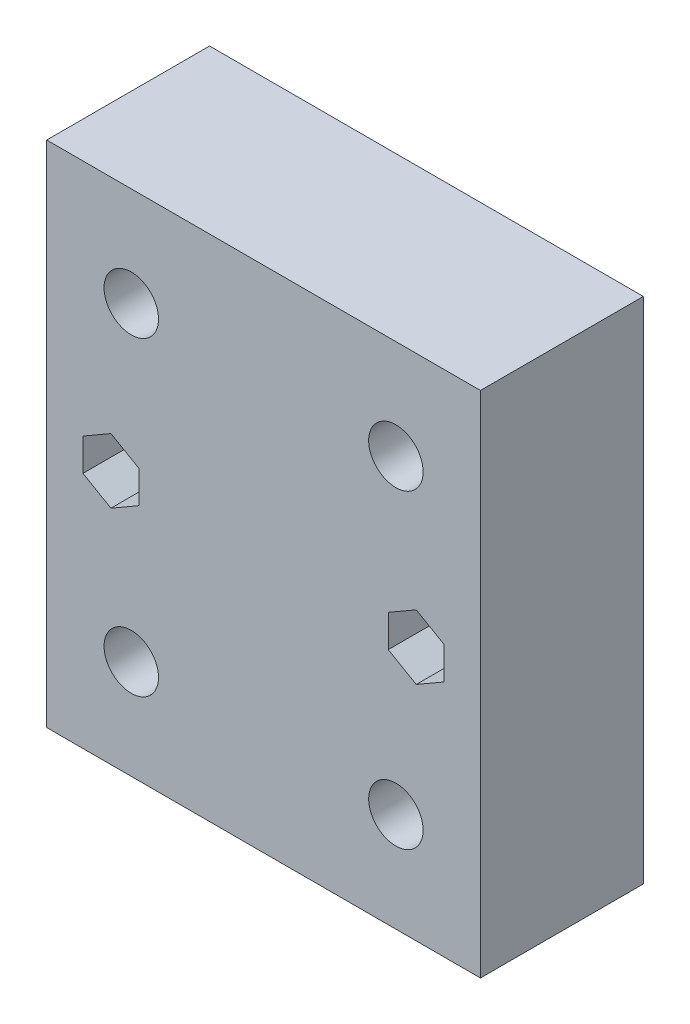
ISO-10303-21;
HEADER;
FILE_DESCRIPTION(('STEP AP214'),'2;1');
FILE_NAME('part.step','',(''),(''),'','','');
FILE_SCHEMA(('AUTOMOTIVE_DESIGN { 1 0 10303 214 1 1 1 1 }'));
ENDSEC;
DATA;
#1=APPLICATION_CONTEXT('core data for automotive mechanical design processes');
#2=APPLICATION_PROTOCOL_DEFINITION('international standard','automotive_design',2000,#1);
#3=PRODUCT_CONTEXT('',#1,'mechanical');
#4=PRODUCT('Part','Part','',(#3));
#5=PRODUCT_RELATED_PRODUCT_CATEGORY('part','',(#4));
#6=PRODUCT_DEFINITION_FORMATION('','',#4);
#7=PRODUCT_DEFINITION_CONTEXT('part definition',#1,'design');
#8=PRODUCT_DEFINITION('design','',#6,#7);
#9=PRODUCT_DEFINITION_SHAPE('','',#8);
#10=(LENGTH_UNIT() NAMED_UNIT(*) SI_UNIT(.MILLI.,.METRE.));
#11=(NAMED_UNIT(*) PLANE_ANGLE_UNIT() SI_UNIT($,.RADIAN.));
#12=(NAMED_UNIT(*) SI_UNIT($,.STERADIAN.) SOLID_ANGLE_UNIT());
#13=UNCERTAINTY_MEASURE_WITH_UNIT(LENGTH_MEASURE(1.E-05),#10,'distance_accuracy_value','');
#14=(GEOMETRIC_REPRESENTATION_CONTEXT(3) GLOBAL_UNCERTAINTY_ASSIGNED_CONTEXT((#13)) GLOBAL_UNIT_ASSIGNED_CONTEXT((#10,
#11,#12)) REPRESENTATION_CONTEXT('',''));
#15=CARTESIAN_POINT('',(0.,0.,0.));
#16=DIRECTION('',(0.,0.,1.));
#17=DIRECTION('',(1.,0.,0.));
#18=AXIS2_PLACEMENT_3D('',#15,#16,#17);
#19=CARTESIAN_POINT('',(-15.,0.,10.));
#20=DIRECTION('',(0.,0.,-1.));
#21=DIRECTION('',(-1.,0.,0.));
#22=AXIS2_PLACEMENT_3D('',#19,#20,#21);
#23=CYLINDRICAL_SURFACE('',#22,1.75);
#24=CARTESIAN_POINT('',(-15.,0.,0.));
#25=DIRECTION('',(0.,0.,-1.));
#26=DIRECTION('',(1.,0.,0.));
#27=AXIS2_PLACEMENT_3D('',#24,#25,#26);
#28=CIRCLE('',#27,1.75);
#29=CARTESIAN_POINT('',(-13.25,0.,0.));
#30=VERTEX_POINT('',#29);
#31=EDGE_CURVE('E362',#30,#30,#28,.T.);
#32=ORIENTED_EDGE('',*,*,#31,.T.);
#33=EDGE_LOOP('',(#32));
#34=FACE_BOUND('',#33,.T.);
#35=CARTESIAN_POINT('',(-15.,0.,5.));
#36=DIRECTION('',(0.,0.,1.));
#37=DIRECTION('',(1.,0.,0.));
#38=AXIS2_PLACEMENT_3D('',#35,#36,#37);
#39=CIRCLE('',#38,1.75);
#40=CARTESIAN_POINT('',(-13.25,0.,5.));
#41=VERTEX_POINT('',#40);
#42=EDGE_CURVE('E47',#41,#41,#39,.F.);
#43=ORIENTED_EDGE('',*,*,#42,.F.);
#44=EDGE_LOOP('',(#43));
#45=FACE_BOUND('',#44,.T.);
#46=ADVANCED_FACE('F43',(#34,#45),#23,.F.);
#47=CARTESIAN_POINT('',(0.,0.,16.));
#48=DIRECTION('',(0.,0.,-1.));
#49=DIRECTION('',(-1.,0.,0.));
#50=AXIS2_PLACEMENT_3D('',#47,#48,#49);
#51=PLANE('',#50);
#52=DIRECTION('',(0.,1.,0.));
#53=VECTOR('',#52,1.);
#54=CARTESIAN_POINT('',(12.25,-1.58771324027148,16.));
#55=LINE('',#54,#53);
#56=CARTESIAN_POINT('',(12.25,-1.58771324027148,16.));
#57=VERTEX_POINT('',#56);
#58=CARTESIAN_POINT('',(12.25,1.58771324027147,16.));
#59=VERTEX_POINT('',#58);
#60=EDGE_CURVE('E202',#57,#59,#55,.T.);
#61=ORIENTED_EDGE('',*,*,#60,.T.);
#62=DIRECTION('',(0.866025403784439,0.5,0.));
#63=VECTOR('',#62,1.);
#64=CARTESIAN_POINT('',(12.25,1.58771324027147,16.));
#65=LINE('',#64,#63);
#66=CARTESIAN_POINT('',(15.,3.17542648054294,16.));
#67=VERTEX_POINT('',#66);
#68=EDGE_CURVE('E193',#59,#67,#65,.T.);
#69=ORIENTED_EDGE('',*,*,#68,.T.);
#70=DIRECTION('',(0.866025403784439,-0.5,0.));
#71=VECTOR('',#70,1.);
#72=CARTESIAN_POINT('',(15.,3.17542648054294,16.));
#73=LINE('',#72,#71);
#74=CARTESIAN_POINT('',(17.75,1.58771324027147,16.));
#75=VERTEX_POINT('',#74);
#76=EDGE_CURVE('E205',#67,#75,#73,.T.);
#77=ORIENTED_EDGE('',*,*,#76,.T.);
#78=DIRECTION('',(0.,-1.,0.));
#79=VECTOR('',#78,1.);
#80=CARTESIAN_POINT('',(17.75,1.58771324027147,16.));
#81=LINE('',#80,#79);
#82=CARTESIAN_POINT('',(17.75,-1.58771324027147,16.));
#83=VERTEX_POINT('',#82);
#84=EDGE_CURVE('E61',#75,#83,#81,.T.);
#85=ORIENTED_EDGE('',*,*,#84,.T.);
#86=DIRECTION('',(-0.866025403784439,-0.5,0.));
#87=VECTOR('',#86,1.);
#88=CARTESIAN_POINT('',(17.75,-1.58771324027147,16.));
#89=LINE('',#88,#87);
#90=CARTESIAN_POINT('',(15.,-3.17542648054295,16.));
#91=VERTEX_POINT('',#90);
#92=EDGE_CURVE('E224',#83,#91,#89,.T.);
#93=ORIENTED_EDGE('',*,*,#92,.T.);
#94=DIRECTION('',(-0.866025403784439,0.5,0.));
#95=VECTOR('',#94,1.);
#96=CARTESIAN_POINT('',(15.,-3.17542648054295,16.));
#97=LINE('',#96,#95);
#98=EDGE_CURVE('E228',#91,#57,#97,.T.);
#99=ORIENTED_EDGE('',*,*,#98,.T.);
#100=EDGE_LOOP('',(#61,#69,#77,#85,#93,#99));
#101=FACE_BOUND('',#100,.T.);
#102=DIRECTION('',(0.866025403784439,-0.5,0.));
#103=VECTOR('',#102,1.);
#104=CARTESIAN_POINT('',(-12.25,1.58771324027147,16.));
#105=LINE('',#104,#103);
#106=CARTESIAN_POINT('',(-15.,3.17542648054294,16.));
#107=VERTEX_POINT('',#106);
#108=CARTESIAN_POINT('',(-12.25,1.58771324027147,16.));
#109=VERTEX_POINT('',#108);
#110=EDGE_CURVE('E268',#107,#109,#105,.T.);
#111=ORIENTED_EDGE('',*,*,#110,.T.);
#112=DIRECTION('',(0.,-1.,0.));
#113=VECTOR('',#112,1.);
#114=CARTESIAN_POINT('',(-12.25,-1.58771324027148,16.));
#115=LINE('',#114,#113);
#116=CARTESIAN_POINT('',(-12.25,-1.58771324027148,16.));
#117=VERTEX_POINT('',#116);
#118=EDGE_CURVE('E289',#109,#117,#115,.T.);
#119=ORIENTED_EDGE('',*,*,#118,.T.);
#120=DIRECTION('',(-0.866025403784439,-0.5,0.));
#121=VECTOR('',#120,1.);
#122=CARTESIAN_POINT('',(-15.,-3.17542648054295,16.));
#123=LINE('',#122,#121);
#124=CARTESIAN_POINT('',(-15.,-3.17542648054294,16.));
#125=VERTEX_POINT('',#124);
#126=EDGE_CURVE('E321',#117,#125,#123,.T.);
#127=ORIENTED_EDGE('',*,*,#126,.T.);
#128=DIRECTION('',(-0.866025403784439,0.5,0.));
#129=VECTOR('',#128,1.);
#130=CARTESIAN_POINT('',(-17.75,-1.58771324027147,16.));
#131=LINE('',#130,#129);
#132=CARTESIAN_POINT('',(-17.75,-1.58771324027147,16.));
#133=VERTEX_POINT('',#132);
#134=EDGE_CURVE('E69',#125,#133,#131,.T.);
#135=ORIENTED_EDGE('',*,*,#134,.T.);
#136=DIRECTION('',(0.,1.,0.));
#137=VECTOR('',#136,1.);
#138=CARTESIAN_POINT('',(-17.75,1.58771324027147,16.));
#139=LINE('',#138,#137);
#140=CARTESIAN_POINT('',(-17.75,1.58771324027147,16.));
#141=VERTEX_POINT('',#140);
#142=EDGE_CURVE('E315',#133,#141,#139,.T.);
#143=ORIENTED_EDGE('',*,*,#142,.T.);
#144=DIRECTION('',(0.866025403784439,0.5,0.));
#145=VECTOR('',#144,1.);
#146=CARTESIAN_POINT('',(-15.,3.17542648054294,16.));
#147=LINE('',#146,#145);
#148=EDGE_CURVE('E311',#141,#107,#147,.T.);
#149=ORIENTED_EDGE('',*,*,#148,.T.);
#150=EDGE_LOOP('',(#111,#119,#127,#135,#143,#149));
#151=FACE_BOUND('',#150,.T.);
#152=DIRECTION('',(0.,-1.,0.));
#153=VECTOR('',#152,1.);
#154=CARTESIAN_POINT('',(-21.3114754098361,25.,16.));
#155=LINE('',#154,#153);
#156=CARTESIAN_POINT('',(-21.3114754098361,25.,16.));
#157=VERTEX_POINT('',#156);
#158=CARTESIAN_POINT('',(-21.3114754098361,-25.,16.));
#159=VERTEX_POINT('',#158);
#160=EDGE_CURVE('E424',#157,#159,#155,.T.);
#161=ORIENTED_EDGE('',*,*,#160,.T.);
#162=DIRECTION('',(1.,0.,0.));
#163=VECTOR('',#162,1.);
#164=CARTESIAN_POINT('',(21.3114754098361,-25.,16.));
#165=LINE('',#164,#163);
#166=CARTESIAN_POINT('',(21.3114754098361,-25.,16.));
#167=VERTEX_POINT('',#166);
#168=EDGE_CURVE('E428',#159,#167,#165,.T.);
#169=ORIENTED_EDGE('',*,*,#168,.T.);
#170=DIRECTION('',(0.,1.,0.));
#171=VECTOR('',#170,1.);
#172=CARTESIAN_POINT('',(21.3114754098361,25.,16.));
#173=LINE('',#172,#171);
#174=CARTESIAN_POINT('',(21.3114754098361,25.,16.));
#175=VERTEX_POINT('',#174);
#176=EDGE_CURVE('E432',#167,#175,#173,.T.);
#177=ORIENTED_EDGE('',*,*,#176,.T.);
#178=DIRECTION('',(-1.,0.,0.));
#179=VECTOR('',#178,1.);
#180=CARTESIAN_POINT('',(21.3114754098361,25.,16.));
#181=LINE('',#180,#179);
#182=EDGE_CURVE('E435',#175,#157,#181,.T.);
#183=ORIENTED_EDGE('',*,*,#182,.T.);
#184=EDGE_LOOP('',(#161,#169,#177,#183));
#185=FACE_BOUND('',#184,.T.);
#186=CARTESIAN_POINT('',(-13.,-15.25,16.));
#187=DIRECTION('',(0.,0.,1.));
#188=DIRECTION('',(1.,0.,0.));
#189=AXIS2_PLACEMENT_3D('',#186,#187,#188);
#190=CIRCLE('',#189,2.67701813439658);
#191=CARTESIAN_POINT('',(-10.3229818656034,-15.25,16.));
#192=VERTEX_POINT('',#191);
#193=EDGE_CURVE('E416',#192,#192,#190,.T.);
#194=ORIENTED_EDGE('',*,*,#193,.F.);
#195=EDGE_LOOP('',(#194));
#196=FACE_BOUND('',#195,.T.);
#197=CARTESIAN_POINT('',(13.,-15.25,16.));
#198=DIRECTION('',(0.,0.,1.));
#199=DIRECTION('',(-1.,0.,0.));
#200=AXIS2_PLACEMENT_3D('',#197,#198,#199);
#201=CIRCLE('',#200,2.67701813439658);
#202=CARTESIAN_POINT('',(10.3229818656034,-15.25,16.));
#203=VERTEX_POINT('',#202);
#204=EDGE_CURVE('E408',#203,#203,#201,.T.);
#205=ORIENTED_EDGE('',*,*,#204,.F.);
#206=EDGE_LOOP('',(#205));
#207=FACE_BOUND('',#206,.T.);
#208=CARTESIAN_POINT('',(13.,15.25,16.));
#209=DIRECTION('',(0.,0.,1.));
#210=DIRECTION('',(1.,0.,0.));
#211=AXIS2_PLACEMENT_3D('',#208,#209,#210);
#212=CIRCLE('',#211,2.67701813439658);
#213=CARTESIAN_POINT('',(15.6770181343966,15.25,16.));
#214=VERTEX_POINT('',#213);
#215=EDGE_CURVE('E400',#214,#214,#212,.T.);
#216=ORIENTED_EDGE('',*,*,#215,.F.);
#217=EDGE_LOOP('',(#216));
#218=FACE_BOUND('',#217,.T.);
#219=CARTESIAN_POINT('',(-13.,15.25,16.));
#220=DIRECTION('',(0.,0.,1.));
#221=DIRECTION('',(-1.,0.,0.));
#222=AXIS2_PLACEMENT_3D('',#219,#220,#221);
#223=CIRCLE('',#222,2.67701813439658);
#224=CARTESIAN_POINT('',(-15.6770181343966,15.25,16.));
#225=VERTEX_POINT('',#224);
#226=EDGE_CURVE('E392',#225,#225,#223,.T.);
#227=ORIENTED_EDGE('',*,*,#226,.F.);
#228=EDGE_LOOP('',(#227));
#229=FACE_BOUND('',#228,.T.);
#230=ADVANCED_FACE('F210',(#101,#151,#185,#196,#207,#218,#229),#51,.F.);
#231=CARTESIAN_POINT('',(0.,0.,0.));
#232=DIRECTION('',(0.,0.,-1.));
#233=DIRECTION('',(-1.,0.,0.));
#234=AXIS2_PLACEMENT_3D('',#231,#232,#233);
#235=PLANE('',#234);
#236=CARTESIAN_POINT('',(15.,0.,0.));
#237=DIRECTION('',(0.,0.,-1.));
#238=DIRECTION('',(-1.,0.,0.));
#239=AXIS2_PLACEMENT_3D('',#236,#237,#238);
#240=CIRCLE('',#239,1.75);
#241=CARTESIAN_POINT('',(13.25,0.,0.));
#242=VERTEX_POINT('',#241);
#243=EDGE_CURVE('E375',#242,#242,#240,.T.);
#244=ORIENTED_EDGE('',*,*,#243,.F.);
#245=EDGE_LOOP('',(#244));
#246=FACE_BOUND('',#245,.T.);
#247=ORIENTED_EDGE('',*,*,#31,.F.);
#248=EDGE_LOOP('',(#247));
#249=FACE_BOUND('',#248,.T.);
#250=CARTESIAN_POINT('',(0.,0.,0.));
#251=DIRECTION('',(0.,0.,1.));
#252=DIRECTION('',(1.,0.,0.));
#253=AXIS2_PLACEMENT_3D('',#250,#251,#252);
#254=CIRCLE('',#253,11.);
#255=CARTESIAN_POINT('',(11.,0.,0.));
#256=VERTEX_POINT('',#255);
#257=EDGE_CURVE('E379',#256,#256,#254,.T.);
#258=ORIENTED_EDGE('',*,*,#257,.T.);
#259=EDGE_LOOP('',(#258));
#260=FACE_BOUND('',#259,.T.);
#261=CARTESIAN_POINT('',(13.,15.25,0.));
#262=DIRECTION('',(0.,0.,1.));
#263=DIRECTION('',(1.,0.,0.));
#264=AXIS2_PLACEMENT_3D('',#261,#262,#263);
#265=CIRCLE('',#264,2.67701813439658);
#266=CARTESIAN_POINT('',(15.6770181343966,15.25,0.));
#267=VERTEX_POINT('',#266);
#268=EDGE_CURVE('E396',#267,#267,#265,.T.);
#269=ORIENTED_EDGE('',*,*,#268,.T.);
#270=EDGE_LOOP('',(#269));
#271=FACE_BOUND('',#270,.T.);
#272=CARTESIAN_POINT('',(-13.,-15.25,0.));
#273=DIRECTION('',(0.,0.,1.));
#274=DIRECTION('',(1.,0.,0.));
#275=AXIS2_PLACEMENT_3D('',#272,#273,#274);
#276=CIRCLE('',#275,2.67701813439658);
#277=CARTESIAN_POINT('',(-10.3229818656034,-15.25,0.));
#278=VERTEX_POINT('',#277);
#279=EDGE_CURVE('E412',#278,#278,#276,.T.);
#280=ORIENTED_EDGE('',*,*,#279,.T.);
#281=EDGE_LOOP('',(#280));
#282=FACE_BOUND('',#281,.T.);
#283=DIRECTION('',(0.,-1.,0.));
#284=VECTOR('',#283,1.);
#285=CARTESIAN_POINT('',(-21.3114754098361,25.,0.));
#286=LINE('',#285,#284);
#287=CARTESIAN_POINT('',(-21.3114754098361,25.,0.));
#288=VERTEX_POINT('',#287);
#289=CARTESIAN_POINT('',(-21.3114754098361,-25.,0.));
#290=VERTEX_POINT('',#289);
#291=EDGE_CURVE('E420',#288,#290,#286,.T.);
#292=ORIENTED_EDGE('',*,*,#291,.F.);
#293=DIRECTION('',(-1.,0.,0.));
#294=VECTOR('',#293,1.);
#295=CARTESIAN_POINT('',(21.3114754098361,25.,0.));
#296=LINE('',#295,#294);
#297=CARTESIAN_POINT('',(21.3114754098361,25.,0.));
#298=VERTEX_POINT('',#297);
#299=EDGE_CURVE('E429',#298,#288,#296,.T.);
#300=ORIENTED_EDGE('',*,*,#299,.F.);
#301=DIRECTION('',(0.,1.,0.));
#302=VECTOR('',#301,1.);
#303=CARTESIAN_POINT('',(21.3114754098361,25.,0.));
#304=LINE('',#303,#302);
#305=CARTESIAN_POINT('',(21.3114754098361,-25.,0.));
#306=VERTEX_POINT('',#305);
#307=EDGE_CURVE('E445',#306,#298,#304,.T.);
#308=ORIENTED_EDGE('',*,*,#307,.F.);
#309=DIRECTION('',(1.,0.,0.));
#310=VECTOR('',#309,1.);
#311=CARTESIAN_POINT('',(21.3114754098361,-25.,0.));
#312=LINE('',#311,#310);
#313=EDGE_CURVE('E442',#290,#306,#312,.T.);
#314=ORIENTED_EDGE('',*,*,#313,.F.);
#315=EDGE_LOOP('',(#292,#300,#308,#314));
#316=FACE_BOUND('',#315,.T.);
#317=CARTESIAN_POINT('',(13.,-15.25,0.));
#318=DIRECTION('',(0.,0.,1.));
#319=DIRECTION('',(-1.,0.,0.));
#320=AXIS2_PLACEMENT_3D('',#317,#318,#319);
#321=CIRCLE('',#320,2.67701813439658);
#322=CARTESIAN_POINT('',(10.3229818656034,-15.25,0.));
#323=VERTEX_POINT('',#322);
#324=EDGE_CURVE('E404',#323,#323,#321,.T.);
#325=ORIENTED_EDGE('',*,*,#324,.T.);
#326=EDGE_LOOP('',(#325));
#327=FACE_BOUND('',#326,.T.);
#328=CARTESIAN_POINT('',(-13.,15.25,0.));
#329=DIRECTION('',(0.,0.,1.));
#330=DIRECTION('',(-1.,0.,0.));
#331=AXIS2_PLACEMENT_3D('',#328,#329,#330);
#332=CIRCLE('',#331,2.67701813439658);
#333=CARTESIAN_POINT('',(-15.6770181343966,15.25,0.));
#334=VERTEX_POINT('',#333);
#335=EDGE_CURVE('E387',#334,#334,#332,.T.);
#336=ORIENTED_EDGE('',*,*,#335,.T.);
#337=EDGE_LOOP('',(#336));
#338=FACE_BOUND('',#337,.T.);
#339=ADVANCED_FACE('F476',(#246,#249,#260,#271,#282,#316,#327,#338),#235,.T.);
#340=CARTESIAN_POINT('',(-21.3114754098361,25.,16.));
#341=DIRECTION('',(1.,0.,0.));
#342=DIRECTION('',(0.,0.,-1.));
#343=AXIS2_PLACEMENT_3D('',#340,#341,#342);
#344=PLANE('',#343);
#345=ORIENTED_EDGE('',*,*,#291,.T.);
#346=DIRECTION('',(0.,0.,-1.));
#347=VECTOR('',#346,1.);
#348=CARTESIAN_POINT('',(-21.3114754098361,-25.,16.));
#349=LINE('',#348,#347);
#350=EDGE_CURVE('E11',#159,#290,#349,.T.);
#351=ORIENTED_EDGE('',*,*,#350,.F.);
#352=ORIENTED_EDGE('',*,*,#160,.F.);
#353=DIRECTION('',(0.,0.,-1.));
#354=VECTOR('',#353,1.);
#355=CARTESIAN_POINT('',(-21.3114754098361,25.,16.));
#356=LINE('',#355,#354);
#357=EDGE_CURVE('E438',#157,#288,#356,.T.);
#358=ORIENTED_EDGE('',*,*,#357,.T.);
#359=EDGE_LOOP('',(#345,#351,#352,#358));
#360=FACE_BOUND('',#359,.T.);
#361=ADVANCED_FACE('F45',(#360),#344,.F.);
#362=CARTESIAN_POINT('',(21.3114754098361,-25.,16.));
#363=DIRECTION('',(0.,1.,0.));
#364=DIRECTION('',(0.,0.,1.));
#365=AXIS2_PLACEMENT_3D('',#362,#363,#364);
#366=PLANE('',#365);
#367=DIRECTION('',(1.,0.,0.));
#368=VECTOR('',#367,1.);
#369=CARTESIAN_POINT('',(4.51701883571232,-25.,11.));
#370=LINE('',#369,#368);
#371=CARTESIAN_POINT('',(-4.51701883571232,-25.,11.));
#372=VERTEX_POINT('',#371);
#373=CARTESIAN_POINT('',(4.51701883571232,-25.,11.));
#374=VERTEX_POINT('',#373);
#375=EDGE_CURVE('E348',#372,#374,#370,.T.);
#376=ORIENTED_EDGE('',*,*,#375,.F.);
#377=DIRECTION('',(0.,0.,-1.));
#378=VECTOR('',#377,1.);
#379=CARTESIAN_POINT('',(-4.51701883571232,-25.,11.));
#380=LINE('',#379,#378);
#381=CARTESIAN_POINT('',(-4.51701883571232,-25.,13.3875314082809));
#382=VERTEX_POINT('',#381);
#383=EDGE_CURVE('E345',#382,#372,#380,.T.);
#384=ORIENTED_EDGE('',*,*,#383,.F.);
#385=DIRECTION('',(-1.,0.,0.));
#386=VECTOR('',#385,1.);
#387=CARTESIAN_POINT('',(4.51701883571232,-25.,13.3875314082809));
#388=LINE('',#387,#386);
#389=CARTESIAN_POINT('',(4.51701883571232,-25.,13.3875314082809));
#390=VERTEX_POINT('',#389);
#391=EDGE_CURVE('E333',#390,#382,#388,.T.);
#392=ORIENTED_EDGE('',*,*,#391,.F.);
#393=DIRECTION('',(0.,0.,1.));
#394=VECTOR('',#393,1.);
#395=CARTESIAN_POINT('',(4.51701883571232,-25.,11.));
#396=LINE('',#395,#394);
#397=EDGE_CURVE('E352',#374,#390,#396,.T.);
#398=ORIENTED_EDGE('',*,*,#397,.F.);
#399=EDGE_LOOP('',(#376,#384,#392,#398));
#400=FACE_BOUND('',#399,.T.);
#401=ORIENTED_EDGE('',*,*,#313,.T.);
#402=DIRECTION('',(0.,0.,-1.));
#403=VECTOR('',#402,1.);
#404=CARTESIAN_POINT('',(21.3114754098361,-25.,16.));
#405=LINE('',#404,#403);
#406=EDGE_CURVE('E53',#167,#306,#405,.T.);
#407=ORIENTED_EDGE('',*,*,#406,.F.);
#408=ORIENTED_EDGE('',*,*,#168,.F.);
#409=ORIENTED_EDGE('',*,*,#350,.T.);
#410=EDGE_LOOP('',(#401,#407,#408,#409));
#411=FACE_BOUND('',#410,.T.);
#412=ADVANCED_FACE('F515',(#400,#411),#366,.F.);
#413=CARTESIAN_POINT('',(21.3114754098361,25.,16.));
#414=DIRECTION('',(-1.,0.,0.));
#415=DIRECTION('',(0.,0.,1.));
#416=AXIS2_PLACEMENT_3D('',#413,#414,#415);
#417=PLANE('',#416);
#418=ORIENTED_EDGE('',*,*,#307,.T.);
#419=DIRECTION('',(0.,0.,-1.));
#420=VECTOR('',#419,1.);
#421=CARTESIAN_POINT('',(21.3114754098361,25.,16.));
#422=LINE('',#421,#420);
#423=EDGE_CURVE('E453',#175,#298,#422,.T.);
#424=ORIENTED_EDGE('',*,*,#423,.F.);
#425=ORIENTED_EDGE('',*,*,#176,.F.);
#426=ORIENTED_EDGE('',*,*,#406,.T.);
#427=EDGE_LOOP('',(#418,#424,#425,#426));
#428=FACE_BOUND('',#427,.T.);
#429=ADVANCED_FACE('F512',(#428),#417,.F.);
#430=CARTESIAN_POINT('',(21.3114754098361,25.,16.));
#431=DIRECTION('',(0.,-1.,0.));
#432=DIRECTION('',(0.,0.,-1.));
#433=AXIS2_PLACEMENT_3D('',#430,#431,#432);
#434=PLANE('',#433);
#435=ORIENTED_EDGE('',*,*,#299,.T.);
#436=ORIENTED_EDGE('',*,*,#357,.F.);
#437=ORIENTED_EDGE('',*,*,#182,.F.);
#438=ORIENTED_EDGE('',*,*,#423,.T.);
#439=EDGE_LOOP('',(#435,#436,#437,#438));
#440=FACE_BOUND('',#439,.T.);
#441=ADVANCED_FACE('F504',(#440),#434,.F.);
#442=CARTESIAN_POINT('',(-13.,-15.25,16.));
#443=DIRECTION('',(0.,0.,-1.));
#444=DIRECTION('',(-1.,0.,0.));
#445=AXIS2_PLACEMENT_3D('',#442,#443,#444);
#446=CYLINDRICAL_SURFACE('',#445,2.67701813439658);
#447=ORIENTED_EDGE('',*,*,#193,.T.);
#448=EDGE_LOOP('',(#447));
#449=FACE_BOUND('',#448,.T.);
#450=ORIENTED_EDGE('',*,*,#279,.F.);
#451=EDGE_LOOP('',(#450));
#452=FACE_BOUND('',#451,.T.);
#453=ADVANCED_FACE('F501',(#449,#452),#446,.F.);
#454=CARTESIAN_POINT('',(13.,-15.25,16.));
#455=DIRECTION('',(0.,0.,-1.));
#456=DIRECTION('',(-1.,0.,0.));
#457=AXIS2_PLACEMENT_3D('',#454,#455,#456);
#458=CYLINDRICAL_SURFACE('',#457,2.67701813439658);
#459=ORIENTED_EDGE('',*,*,#204,.T.);
#460=EDGE_LOOP('',(#459));
#461=FACE_BOUND('',#460,.T.);
#462=ORIENTED_EDGE('',*,*,#324,.F.);
#463=EDGE_LOOP('',(#462));
#464=FACE_BOUND('',#463,.T.);
#465=ADVANCED_FACE('F497',(#461,#464),#458,.F.);
#466=CARTESIAN_POINT('',(13.,15.25,16.));
#467=DIRECTION('',(0.,0.,-1.));
#468=DIRECTION('',(-1.,0.,0.));
#469=AXIS2_PLACEMENT_3D('',#466,#467,#468);
#470=CYLINDRICAL_SURFACE('',#469,2.67701813439658);
#471=ORIENTED_EDGE('',*,*,#215,.T.);
#472=EDGE_LOOP('',(#471));
#473=FACE_BOUND('',#472,.T.);
#474=ORIENTED_EDGE('',*,*,#268,.F.);
#475=EDGE_LOOP('',(#474));
#476=FACE_BOUND('',#475,.T.);
#477=ADVANCED_FACE('F493',(#473,#476),#470,.F.);
#478=CARTESIAN_POINT('',(-13.,15.25,16.));
#479=DIRECTION('',(0.,0.,-1.));
#480=DIRECTION('',(-1.,0.,0.));
#481=AXIS2_PLACEMENT_3D('',#478,#479,#480);
#482=CYLINDRICAL_SURFACE('',#481,2.67701813439658);
#483=ORIENTED_EDGE('',*,*,#226,.T.);
#484=EDGE_LOOP('',(#483));
#485=FACE_BOUND('',#484,.T.);
#486=ORIENTED_EDGE('',*,*,#335,.F.);
#487=EDGE_LOOP('',(#486));
#488=FACE_BOUND('',#487,.T.);
#489=ADVANCED_FACE('F489',(#485,#488),#482,.F.);
#490=CARTESIAN_POINT('',(0.,0.,11.));
#491=DIRECTION('',(0.,0.,-1.));
#492=DIRECTION('',(-1.,0.,0.));
#493=AXIS2_PLACEMENT_3D('',#490,#491,#492);
#494=CYLINDRICAL_SURFACE('',#493,11.);
#495=CARTESIAN_POINT('',(0.,0.,11.));
#496=DIRECTION('',(0.,0.,1.));
#497=DIRECTION('',(1.,0.,0.));
#498=AXIS2_PLACEMENT_3D('',#495,#496,#497);
#499=CIRCLE('',#498,11.);
#500=CARTESIAN_POINT('',(-4.51701883571232,-10.0297826914555,11.));
#501=VERTEX_POINT('',#500);
#502=CARTESIAN_POINT('',(4.51701883571232,-10.0297826914555,11.));
#503=VERTEX_POINT('',#502);
#504=EDGE_CURVE('E383',#501,#503,#499,.T.);
#505=ORIENTED_EDGE('',*,*,#504,.T.);
#506=EDGE_CURVE('E388',#503,#501,#499,.T.);
#507=ORIENTED_EDGE('',*,*,#506,.T.);
#508=EDGE_LOOP('',(#505,#507));
#509=FACE_BOUND('',#508,.T.);
#510=ORIENTED_EDGE('',*,*,#257,.F.);
#511=EDGE_LOOP('',(#510));
#512=FACE_BOUND('',#511,.T.);
#513=ADVANCED_FACE('F485',(#509,#512),#494,.F.);
#514=CARTESIAN_POINT('',(0.,0.,11.));
#515=DIRECTION('',(0.,0.,1.));
#516=DIRECTION('',(1.,0.,0.));
#517=AXIS2_PLACEMENT_3D('',#514,#515,#516);
#518=PLANE('',#517);
#519=DIRECTION('',(1.,0.,0.));
#520=VECTOR('',#519,1.);
#521=CARTESIAN_POINT('',(4.51701883571232,-4.99999999999999,11.));
#522=LINE('',#521,#520);
#523=CARTESIAN_POINT('',(-4.51701883571232,-4.99999999999999,11.));
#524=VERTEX_POINT('',#523);
#525=CARTESIAN_POINT('',(4.51701883571232,-4.99999999999999,11.));
#526=VERTEX_POINT('',#525);
#527=EDGE_CURVE('E332',#524,#526,#522,.T.);
#528=ORIENTED_EDGE('',*,*,#527,.F.);
#529=DIRECTION('',(0.,-1.,0.));
#530=VECTOR('',#529,1.);
#531=CARTESIAN_POINT('',(-4.51701883571232,-4.99999999999999,11.));
#532=LINE('',#531,#530);
#533=EDGE_CURVE('E371',#524,#501,#532,.T.);
#534=ORIENTED_EDGE('',*,*,#533,.T.);
#535=ORIENTED_EDGE('',*,*,#506,.F.);
#536=DIRECTION('',(0.,-1.,0.));
#537=VECTOR('',#536,1.);
#538=CARTESIAN_POINT('',(4.51701883571232,-4.99999999999999,11.));
#539=LINE('',#538,#537);
#540=EDGE_CURVE('E366',#526,#503,#539,.T.);
#541=ORIENTED_EDGE('',*,*,#540,.F.);
#542=EDGE_LOOP('',(#528,#534,#535,#541));
#543=FACE_BOUND('',#542,.T.);
#544=ADVANCED_FACE('F482',(#543),#518,.F.);
#545=CARTESIAN_POINT('',(15.,0.,10.));
#546=DIRECTION('',(0.,0.,-1.));
#547=DIRECTION('',(-1.,0.,0.));
#548=AXIS2_PLACEMENT_3D('',#545,#546,#547);
#549=CYLINDRICAL_SURFACE('',#548,1.75);
#550=CARTESIAN_POINT('',(15.,0.,5.));
#551=DIRECTION('',(0.,0.,-1.));
#552=DIRECTION('',(-1.,0.,0.));
#553=AXIS2_PLACEMENT_3D('',#550,#551,#552);
#554=CIRCLE('',#553,1.75);
#555=CARTESIAN_POINT('',(13.25,0.,5.));
#556=VERTEX_POINT('',#555);
#557=EDGE_CURVE('E253',#556,#556,#554,.F.);
#558=ORIENTED_EDGE('',*,*,#557,.T.);
#559=EDGE_LOOP('',(#558));
#560=FACE_BOUND('',#559,.T.);
#561=ORIENTED_EDGE('',*,*,#243,.T.);
#562=EDGE_LOOP('',(#561));
#563=FACE_BOUND('',#562,.T.);
#564=ADVANCED_FACE('F480',(#560,#563),#549,.F.);
#565=CARTESIAN_POINT('',(4.51701883571232,-4.99999999999999,11.));
#566=DIRECTION('',(0.,0.,-1.));
#567=DIRECTION('',(-1.,0.,0.));
#568=AXIS2_PLACEMENT_3D('',#565,#566,#567);
#569=PLANE('',#568);
#570=EDGE_CURVE('E344',#501,#372,#532,.T.);
#571=ORIENTED_EDGE('',*,*,#570,.T.);
#572=ORIENTED_EDGE('',*,*,#375,.T.);
#573=EDGE_CURVE('E370',#503,#374,#539,.T.);
#574=ORIENTED_EDGE('',*,*,#573,.F.);
#575=ORIENTED_EDGE('',*,*,#504,.F.);
#576=EDGE_LOOP('',(#571,#572,#574,#575));
#577=FACE_BOUND('',#576,.T.);
#578=ADVANCED_FACE('F562',(#577),#569,.F.);
#579=CARTESIAN_POINT('',(-4.51701883571232,-4.99999999999999,11.));
#580=DIRECTION('',(-1.,0.,0.));
#581=DIRECTION('',(0.,0.,1.));
#582=AXIS2_PLACEMENT_3D('',#579,#580,#581);
#583=PLANE('',#582);
#584=ORIENTED_EDGE('',*,*,#383,.T.);
#585=ORIENTED_EDGE('',*,*,#570,.F.);
#586=ORIENTED_EDGE('',*,*,#533,.F.);
#587=DIRECTION('',(0.,0.,-1.));
#588=VECTOR('',#587,1.);
#589=CARTESIAN_POINT('',(-4.51701883571232,-4.99999999999999,11.));
#590=LINE('',#589,#588);
#591=CARTESIAN_POINT('',(-4.51701883571232,-4.99999999999999,13.3875314082809));
#592=VERTEX_POINT('',#591);
#593=EDGE_CURVE('E328',#592,#524,#590,.T.);
#594=ORIENTED_EDGE('',*,*,#593,.F.);
#595=DIRECTION('',(0.,-1.,0.));
#596=VECTOR('',#595,1.);
#597=CARTESIAN_POINT('',(-4.51701883571232,-4.99999999999999,13.3875314082809));
#598=LINE('',#597,#596);
#599=EDGE_CURVE('E359',#592,#382,#598,.T.);
#600=ORIENTED_EDGE('',*,*,#599,.T.);
#601=EDGE_LOOP('',(#584,#585,#586,#594,#600));
#602=FACE_BOUND('',#601,.T.);
#603=ADVANCED_FACE('F574',(#602),#583,.F.);
#604=CARTESIAN_POINT('',(4.51701883571232,-4.99999999999999,13.3875314082809));
#605=DIRECTION('',(0.,0.,1.));
#606=DIRECTION('',(1.,0.,0.));
#607=AXIS2_PLACEMENT_3D('',#604,#605,#606);
#608=PLANE('',#607);
#609=ORIENTED_EDGE('',*,*,#391,.T.);
#610=ORIENTED_EDGE('',*,*,#599,.F.);
#611=DIRECTION('',(-1.,0.,0.));
#612=VECTOR('',#611,1.);
#613=CARTESIAN_POINT('',(4.51701883571232,-4.99999999999999,13.3875314082809));
#614=LINE('',#613,#612);
#615=CARTESIAN_POINT('',(4.51701883571232,-4.99999999999999,13.3875314082809));
#616=VERTEX_POINT('',#615);
#617=EDGE_CURVE('E340',#616,#592,#614,.T.);
#618=ORIENTED_EDGE('',*,*,#617,.F.);
#619=DIRECTION('',(0.,-1.,0.));
#620=VECTOR('',#619,1.);
#621=CARTESIAN_POINT('',(4.51701883571232,-4.99999999999999,13.3875314082809));
#622=LINE('',#621,#620);
#623=EDGE_CURVE('E363',#616,#390,#622,.T.);
#624=ORIENTED_EDGE('',*,*,#623,.T.);
#625=EDGE_LOOP('',(#609,#610,#618,#624));
#626=FACE_BOUND('',#625,.T.);
#627=ADVANCED_FACE('F580',(#626),#608,.F.);
#628=CARTESIAN_POINT('',(4.51701883571232,-4.99999999999999,11.));
#629=DIRECTION('',(1.,0.,0.));
#630=DIRECTION('',(0.,0.,-1.));
#631=AXIS2_PLACEMENT_3D('',#628,#629,#630);
#632=PLANE('',#631);
#633=ORIENTED_EDGE('',*,*,#397,.T.);
#634=ORIENTED_EDGE('',*,*,#623,.F.);
#635=DIRECTION('',(0.,0.,1.));
#636=VECTOR('',#635,1.);
#637=CARTESIAN_POINT('',(4.51701883571232,-4.99999999999999,11.));
#638=LINE('',#637,#636);
#639=EDGE_CURVE('E336',#526,#616,#638,.T.);
#640=ORIENTED_EDGE('',*,*,#639,.F.);
#641=ORIENTED_EDGE('',*,*,#540,.T.);
#642=ORIENTED_EDGE('',*,*,#573,.T.);
#643=EDGE_LOOP('',(#633,#634,#640,#641,#642));
#644=FACE_BOUND('',#643,.T.);
#645=ADVANCED_FACE('F582',(#644),#632,.F.);
#646=CARTESIAN_POINT('',(0.,-4.99999999999999,0.));
#647=DIRECTION('',(0.,-1.,0.));
#648=DIRECTION('',(0.,0.,-1.));
#649=AXIS2_PLACEMENT_3D('',#646,#647,#648);
#650=PLANE('',#649);
#651=ORIENTED_EDGE('',*,*,#593,.T.);
#652=ORIENTED_EDGE('',*,*,#527,.T.);
#653=ORIENTED_EDGE('',*,*,#639,.T.);
#654=ORIENTED_EDGE('',*,*,#617,.T.);
#655=EDGE_LOOP('',(#651,#652,#653,#654));
#656=FACE_BOUND('',#655,.T.);
#657=ADVANCED_FACE('F576',(#656),#650,.T.);
#658=CARTESIAN_POINT('',(0.,0.,5.));
#659=DIRECTION('',(0.,0.,-1.));
#660=DIRECTION('',(-1.,0.,0.));
#661=AXIS2_PLACEMENT_3D('',#658,#659,#660);
#662=PLANE('',#661);
#663=DIRECTION('',(0.866025403784439,0.5,0.));
#664=VECTOR('',#663,1.);
#665=CARTESIAN_POINT('',(12.25,1.58771324027147,5.));
#666=LINE('',#665,#664);
#667=CARTESIAN_POINT('',(12.25,1.58771324027147,5.));
#668=VERTEX_POINT('',#667);
#669=CARTESIAN_POINT('',(15.,3.17542648054294,5.));
#670=VERTEX_POINT('',#669);
#671=EDGE_CURVE('E196',#668,#670,#666,.T.);
#672=ORIENTED_EDGE('',*,*,#671,.F.);
#673=DIRECTION('',(0.,1.,0.));
#674=VECTOR('',#673,1.);
#675=CARTESIAN_POINT('',(12.25,-1.58771324027148,5.));
#676=LINE('',#675,#674);
#677=CARTESIAN_POINT('',(12.25,-1.58771324027148,5.));
#678=VERTEX_POINT('',#677);
#679=EDGE_CURVE('E215',#678,#668,#676,.T.);
#680=ORIENTED_EDGE('',*,*,#679,.F.);
#681=DIRECTION('',(-0.866025403784439,0.5,0.));
#682=VECTOR('',#681,1.);
#683=CARTESIAN_POINT('',(15.,-3.17542648054295,5.));
#684=LINE('',#683,#682);
#685=CARTESIAN_POINT('',(15.,-3.17542648054295,5.));
#686=VERTEX_POINT('',#685);
#687=EDGE_CURVE('E219',#686,#678,#684,.T.);
#688=ORIENTED_EDGE('',*,*,#687,.F.);
#689=DIRECTION('',(-0.866025403784439,-0.5,0.));
#690=VECTOR('',#689,1.);
#691=CARTESIAN_POINT('',(17.75,-1.58771324027147,5.));
#692=LINE('',#691,#690);
#693=CARTESIAN_POINT('',(17.75,-1.58771324027147,5.));
#694=VERTEX_POINT('',#693);
#695=EDGE_CURVE('E243',#694,#686,#692,.T.);
#696=ORIENTED_EDGE('',*,*,#695,.F.);
#697=DIRECTION('',(0.,-1.,0.));
#698=VECTOR('',#697,1.);
#699=CARTESIAN_POINT('',(17.75,1.58771324027147,5.));
#700=LINE('',#699,#698);
#701=CARTESIAN_POINT('',(17.75,1.58771324027147,5.));
#702=VERTEX_POINT('',#701);
#703=EDGE_CURVE('E239',#702,#694,#700,.T.);
#704=ORIENTED_EDGE('',*,*,#703,.F.);
#705=DIRECTION('',(0.866025403784439,-0.5,0.));
#706=VECTOR('',#705,1.);
#707=CARTESIAN_POINT('',(15.,3.17542648054294,5.));
#708=LINE('',#707,#706);
#709=EDGE_CURVE('E235',#670,#702,#708,.T.);
#710=ORIENTED_EDGE('',*,*,#709,.F.);
#711=EDGE_LOOP('',(#672,#680,#688,#696,#704,#710));
#712=FACE_BOUND('',#711,.T.);
#713=ORIENTED_EDGE('',*,*,#557,.F.);
#714=EDGE_LOOP('',(#713));
#715=FACE_BOUND('',#714,.T.);
#716=ADVANCED_FACE('F589',(#712,#715),#662,.F.);
#717=CARTESIAN_POINT('',(12.25,1.58771324027147,16.));
#718=DIRECTION('',(-0.5,0.866025403784439,0.));
#719=DIRECTION('',(-0.866025403784439,-0.5,0.));
#720=AXIS2_PLACEMENT_3D('',#717,#718,#719);
#721=PLANE('',#720);
#722=ORIENTED_EDGE('',*,*,#671,.T.);
#723=DIRECTION('',(0.,0.,-1.));
#724=VECTOR('',#723,1.);
#725=CARTESIAN_POINT('',(15.,3.17542648054294,16.));
#726=LINE('',#725,#724);
#727=EDGE_CURVE('E189',#67,#670,#726,.T.);
#728=ORIENTED_EDGE('',*,*,#727,.F.);
#729=ORIENTED_EDGE('',*,*,#68,.F.);
#730=DIRECTION('',(0.,0.,-1.));
#731=VECTOR('',#730,1.);
#732=CARTESIAN_POINT('',(12.25,1.58771324027147,16.));
#733=LINE('',#732,#731);
#734=EDGE_CURVE('E250',#59,#668,#733,.T.);
#735=ORIENTED_EDGE('',*,*,#734,.T.);
#736=EDGE_LOOP('',(#722,#728,#729,#735));
#737=FACE_BOUND('',#736,.T.);
#738=ADVANCED_FACE('F191',(#737),#721,.F.);
#739=CARTESIAN_POINT('',(12.25,-1.58771324027148,16.));
#740=DIRECTION('',(-1.,0.,0.));
#741=DIRECTION('',(0.,0.,1.));
#742=AXIS2_PLACEMENT_3D('',#739,#740,#741);
#743=PLANE('',#742);
#744=ORIENTED_EDGE('',*,*,#679,.T.);
#745=ORIENTED_EDGE('',*,*,#734,.F.);
#746=ORIENTED_EDGE('',*,*,#60,.F.);
#747=DIRECTION('',(0.,0.,-1.));
#748=VECTOR('',#747,1.);
#749=CARTESIAN_POINT('',(12.25,-1.58771324027148,16.));
#750=LINE('',#749,#748);
#751=EDGE_CURVE('E254',#57,#678,#750,.T.);
#752=ORIENTED_EDGE('',*,*,#751,.T.);
#753=EDGE_LOOP('',(#744,#745,#746,#752));
#754=FACE_BOUND('',#753,.T.);
#755=ADVANCED_FACE('F637',(#754),#743,.F.);
#756=CARTESIAN_POINT('',(15.,-3.17542648054295,16.));
#757=DIRECTION('',(-0.5,-0.866025403784439,0.));
#758=DIRECTION('',(0.866025403784439,-0.5,0.));
#759=AXIS2_PLACEMENT_3D('',#756,#757,#758);
#760=PLANE('',#759);
#761=ORIENTED_EDGE('',*,*,#687,.T.);
#762=ORIENTED_EDGE('',*,*,#751,.F.);
#763=ORIENTED_EDGE('',*,*,#98,.F.);
#764=DIRECTION('',(0.,0.,-1.));
#765=VECTOR('',#764,1.);
#766=CARTESIAN_POINT('',(15.,-3.17542648054295,16.));
#767=LINE('',#766,#765);
#768=EDGE_CURVE('E257',#91,#686,#767,.T.);
#769=ORIENTED_EDGE('',*,*,#768,.T.);
#770=EDGE_LOOP('',(#761,#762,#763,#769));
#771=FACE_BOUND('',#770,.T.);
#772=ADVANCED_FACE('F644',(#771),#760,.F.);
#773=CARTESIAN_POINT('',(17.75,-1.58771324027147,16.));
#774=DIRECTION('',(0.5,-0.866025403784439,0.));
#775=DIRECTION('',(0.866025403784439,0.5,0.));
#776=AXIS2_PLACEMENT_3D('',#773,#774,#775);
#777=PLANE('',#776);
#778=ORIENTED_EDGE('',*,*,#695,.T.);
#779=ORIENTED_EDGE('',*,*,#768,.F.);
#780=ORIENTED_EDGE('',*,*,#92,.F.);
#781=DIRECTION('',(0.,0.,-1.));
#782=VECTOR('',#781,1.);
#783=CARTESIAN_POINT('',(17.75,-1.58771324027147,16.));
#784=LINE('',#783,#782);
#785=EDGE_CURVE('E260',#83,#694,#784,.T.);
#786=ORIENTED_EDGE('',*,*,#785,.T.);
#787=EDGE_LOOP('',(#778,#779,#780,#786));
#788=FACE_BOUND('',#787,.T.);
#789=ADVANCED_FACE('F652',(#788),#777,.F.);
#790=CARTESIAN_POINT('',(17.75,1.58771324027147,16.));
#791=DIRECTION('',(1.,0.,0.));
#792=DIRECTION('',(0.,0.,-1.));
#793=AXIS2_PLACEMENT_3D('',#790,#791,#792);
#794=PLANE('',#793);
#795=ORIENTED_EDGE('',*,*,#703,.T.);
#796=ORIENTED_EDGE('',*,*,#785,.F.);
#797=ORIENTED_EDGE('',*,*,#84,.F.);
#798=DIRECTION('',(0.,0.,-1.));
#799=VECTOR('',#798,1.);
#800=CARTESIAN_POINT('',(17.75,1.58771324027147,16.));
#801=LINE('',#800,#799);
#802=EDGE_CURVE('E201',#75,#702,#801,.T.);
#803=ORIENTED_EDGE('',*,*,#802,.T.);
#804=EDGE_LOOP('',(#795,#796,#797,#803));
#805=FACE_BOUND('',#804,.T.);
#806=ADVANCED_FACE('F660',(#805),#794,.F.);
#807=CARTESIAN_POINT('',(15.,3.17542648054294,16.));
#808=DIRECTION('',(0.5,0.866025403784439,0.));
#809=DIRECTION('',(-0.866025403784439,0.5,0.));
#810=AXIS2_PLACEMENT_3D('',#807,#808,#809);
#811=PLANE('',#810);
#812=ORIENTED_EDGE('',*,*,#709,.T.);
#813=ORIENTED_EDGE('',*,*,#802,.F.);
#814=ORIENTED_EDGE('',*,*,#76,.F.);
#815=ORIENTED_EDGE('',*,*,#727,.T.);
#816=EDGE_LOOP('',(#812,#813,#814,#815));
#817=FACE_BOUND('',#816,.T.);
#818=ADVANCED_FACE('F206',(#817),#811,.F.);
#819=CARTESIAN_POINT('',(0.,0.,5.));
#820=DIRECTION('',(0.,0.,1.));
#821=DIRECTION('',(1.,0.,0.));
#822=AXIS2_PLACEMENT_3D('',#819,#820,#821);
#823=PLANE('',#822);
#824=DIRECTION('',(0.,-1.,0.));
#825=VECTOR('',#824,1.);
#826=CARTESIAN_POINT('',(-12.25,-1.58771324027148,5.));
#827=LINE('',#826,#825);
#828=CARTESIAN_POINT('',(-12.25,1.58771324027147,5.));
#829=VERTEX_POINT('',#828);
#830=CARTESIAN_POINT('',(-12.25,-1.58771324027148,5.));
#831=VERTEX_POINT('',#830);
#832=EDGE_CURVE('E236',#829,#831,#827,.T.);
#833=ORIENTED_EDGE('',*,*,#832,.F.);
#834=DIRECTION('',(0.866025403784439,-0.5,0.));
#835=VECTOR('',#834,1.);
#836=CARTESIAN_POINT('',(-12.25,1.58771324027147,5.));
#837=LINE('',#836,#835);
#838=CARTESIAN_POINT('',(-15.,3.17542648054294,5.));
#839=VERTEX_POINT('',#838);
#840=EDGE_CURVE('E284',#839,#829,#837,.T.);
#841=ORIENTED_EDGE('',*,*,#840,.F.);
#842=DIRECTION('',(0.866025403784439,0.5,0.));
#843=VECTOR('',#842,1.);
#844=CARTESIAN_POINT('',(-15.,3.17542648054294,5.));
#845=LINE('',#844,#843);
#846=CARTESIAN_POINT('',(-17.75,1.58771324027147,5.));
#847=VERTEX_POINT('',#846);
#848=EDGE_CURVE('E288',#847,#839,#845,.T.);
#849=ORIENTED_EDGE('',*,*,#848,.F.);
#850=DIRECTION('',(0.,1.,0.));
#851=VECTOR('',#850,1.);
#852=CARTESIAN_POINT('',(-17.75,1.58771324027147,5.));
#853=LINE('',#852,#851);
#854=CARTESIAN_POINT('',(-17.75,-1.58771324027147,5.));
#855=VERTEX_POINT('',#854);
#856=EDGE_CURVE('E293',#855,#847,#853,.T.);
#857=ORIENTED_EDGE('',*,*,#856,.F.);
#858=DIRECTION('',(-0.866025403784439,0.5,0.));
#859=VECTOR('',#858,1.);
#860=CARTESIAN_POINT('',(-17.75,-1.58771324027147,5.));
#861=LINE('',#860,#859);
#862=CARTESIAN_POINT('',(-15.,-3.17542648054295,5.));
#863=VERTEX_POINT('',#862);
#864=EDGE_CURVE('E297',#863,#855,#861,.T.);
#865=ORIENTED_EDGE('',*,*,#864,.F.);
#866=DIRECTION('',(-0.866025403784439,-0.5,0.));
#867=VECTOR('',#866,1.);
#868=CARTESIAN_POINT('',(-15.,-3.17542648054295,5.));
#869=LINE('',#868,#867);
#870=EDGE_CURVE('E301',#831,#863,#869,.T.);
#871=ORIENTED_EDGE('',*,*,#870,.F.);
#872=EDGE_LOOP('',(#833,#841,#849,#857,#865,#871));
#873=FACE_BOUND('',#872,.T.);
#874=ORIENTED_EDGE('',*,*,#42,.T.);
#875=EDGE_LOOP('',(#874));
#876=FACE_BOUND('',#875,.T.);
#877=ADVANCED_FACE('F467',(#873,#876),#823,.T.);
#878=CARTESIAN_POINT('',(-12.25,-1.58771324027148,16.));
#879=DIRECTION('',(1.,0.,0.));
#880=DIRECTION('',(0.,0.,-1.));
#881=AXIS2_PLACEMENT_3D('',#878,#879,#880);
#882=PLANE('',#881);
#883=ORIENTED_EDGE('',*,*,#832,.T.);
#884=DIRECTION('',(0.,0.,-1.));
#885=VECTOR('',#884,1.);
#886=CARTESIAN_POINT('',(-12.25,-1.58771324027148,16.));
#887=LINE('',#886,#885);
#888=EDGE_CURVE('E265',#117,#831,#887,.T.);
#889=ORIENTED_EDGE('',*,*,#888,.F.);
#890=ORIENTED_EDGE('',*,*,#118,.F.);
#891=DIRECTION('',(0.,0.,-1.));
#892=VECTOR('',#891,1.);
#893=CARTESIAN_POINT('',(-12.25,1.58771324027147,16.));
#894=LINE('',#893,#892);
#895=EDGE_CURVE('E281',#109,#829,#894,.T.);
#896=ORIENTED_EDGE('',*,*,#895,.T.);
#897=EDGE_LOOP('',(#883,#889,#890,#896));
#898=FACE_BOUND('',#897,.T.);
#899=ADVANCED_FACE('F680',(#898),#882,.F.);
#900=CARTESIAN_POINT('',(-12.25,1.58771324027147,16.));
#901=DIRECTION('',(0.5,0.866025403784439,0.));
#902=DIRECTION('',(-0.866025403784439,0.5,0.));
#903=AXIS2_PLACEMENT_3D('',#900,#901,#902);
#904=PLANE('',#903);
#905=ORIENTED_EDGE('',*,*,#840,.T.);
#906=ORIENTED_EDGE('',*,*,#895,.F.);
#907=ORIENTED_EDGE('',*,*,#110,.F.);
#908=DIRECTION('',(0.,0.,-1.));
#909=VECTOR('',#908,1.);
#910=CARTESIAN_POINT('',(-15.,3.17542648054294,16.));
#911=LINE('',#910,#909);
#912=EDGE_CURVE('E278',#107,#839,#911,.T.);
#913=ORIENTED_EDGE('',*,*,#912,.T.);
#914=EDGE_LOOP('',(#905,#906,#907,#913));
#915=FACE_BOUND('',#914,.T.);
#916=ADVANCED_FACE('F688',(#915),#904,.F.);
#917=CARTESIAN_POINT('',(-15.,3.17542648054294,16.));
#918=DIRECTION('',(-0.5,0.866025403784439,0.));
#919=DIRECTION('',(-0.866025403784439,-0.5,0.));
#920=AXIS2_PLACEMENT_3D('',#917,#918,#919);
#921=PLANE('',#920);
#922=ORIENTED_EDGE('',*,*,#848,.T.);
#923=ORIENTED_EDGE('',*,*,#912,.F.);
#924=ORIENTED_EDGE('',*,*,#148,.F.);
#925=DIRECTION('',(0.,0.,-1.));
#926=VECTOR('',#925,1.);
#927=CARTESIAN_POINT('',(-17.75,1.58771324027147,16.));
#928=LINE('',#927,#926);
#929=EDGE_CURVE('E275',#141,#847,#928,.T.);
#930=ORIENTED_EDGE('',*,*,#929,.T.);
#931=EDGE_LOOP('',(#922,#923,#924,#930));
#932=FACE_BOUND('',#931,.T.);
#933=ADVANCED_FACE('F696',(#932),#921,.F.);
#934=CARTESIAN_POINT('',(-17.75,1.58771324027147,16.));
#935=DIRECTION('',(-1.,0.,0.));
#936=DIRECTION('',(0.,0.,1.));
#937=AXIS2_PLACEMENT_3D('',#934,#935,#936);
#938=PLANE('',#937);
#939=ORIENTED_EDGE('',*,*,#856,.T.);
#940=ORIENTED_EDGE('',*,*,#929,.F.);
#941=ORIENTED_EDGE('',*,*,#142,.F.);
#942=DIRECTION('',(0.,0.,-1.));
#943=VECTOR('',#942,1.);
#944=CARTESIAN_POINT('',(-17.75,-1.58771324027147,16.));
#945=LINE('',#944,#943);
#946=EDGE_CURVE('E272',#133,#855,#945,.T.);
#947=ORIENTED_EDGE('',*,*,#946,.T.);
#948=EDGE_LOOP('',(#939,#940,#941,#947));
#949=FACE_BOUND('',#948,.T.);
#950=ADVANCED_FACE('F704',(#949),#938,.F.);
#951=CARTESIAN_POINT('',(-17.75,-1.58771324027147,16.));
#952=DIRECTION('',(-0.5,-0.866025403784439,0.));
#953=DIRECTION('',(0.866025403784439,-0.5,0.));
#954=AXIS2_PLACEMENT_3D('',#951,#952,#953);
#955=PLANE('',#954);
#956=ORIENTED_EDGE('',*,*,#864,.T.);
#957=ORIENTED_EDGE('',*,*,#946,.F.);
#958=ORIENTED_EDGE('',*,*,#134,.F.);
#959=DIRECTION('',(0.,0.,-1.));
#960=VECTOR('',#959,1.);
#961=CARTESIAN_POINT('',(-15.,-3.17542648054295,16.));
#962=LINE('',#961,#960);
#963=EDGE_CURVE('E269',#125,#863,#962,.T.);
#964=ORIENTED_EDGE('',*,*,#963,.T.);
#965=EDGE_LOOP('',(#956,#957,#958,#964));
#966=FACE_BOUND('',#965,.T.);
#967=ADVANCED_FACE('F712',(#966),#955,.F.);
#968=CARTESIAN_POINT('',(-15.,-3.17542648054295,16.));
#969=DIRECTION('',(0.5,-0.866025403784439,0.));
#970=DIRECTION('',(0.866025403784439,0.5,0.));
#971=AXIS2_PLACEMENT_3D('',#968,#969,#970);
#972=PLANE('',#971);
#973=ORIENTED_EDGE('',*,*,#870,.T.);
#974=ORIENTED_EDGE('',*,*,#963,.F.);
#975=ORIENTED_EDGE('',*,*,#126,.F.);
#976=ORIENTED_EDGE('',*,*,#888,.T.);
#977=EDGE_LOOP('',(#973,#974,#975,#976));
#978=FACE_BOUND('',#977,.T.);
#979=ADVANCED_FACE('F720',(#978),#972,.F.);
#980=CLOSED_SHELL('',(#46,#230,#339,#361,#412,#429,#441,#453,#465,#477,#489,#513,#544,#564,#578,
#603,#627,#645,#657,#716,#738,#755,#772,#789,#806,#818,#877,#899,#916,#933,#950,#967,#979));
#981=MANIFOLD_SOLID_BREP('B2',#980);
#982=ADVANCED_BREP_SHAPE_REPRESENTATION('',(#18,#981),#14);
#983=SHAPE_DEFINITION_REPRESENTATION(#9,#982);
ENDSEC;
END-ISO-10303-21;
